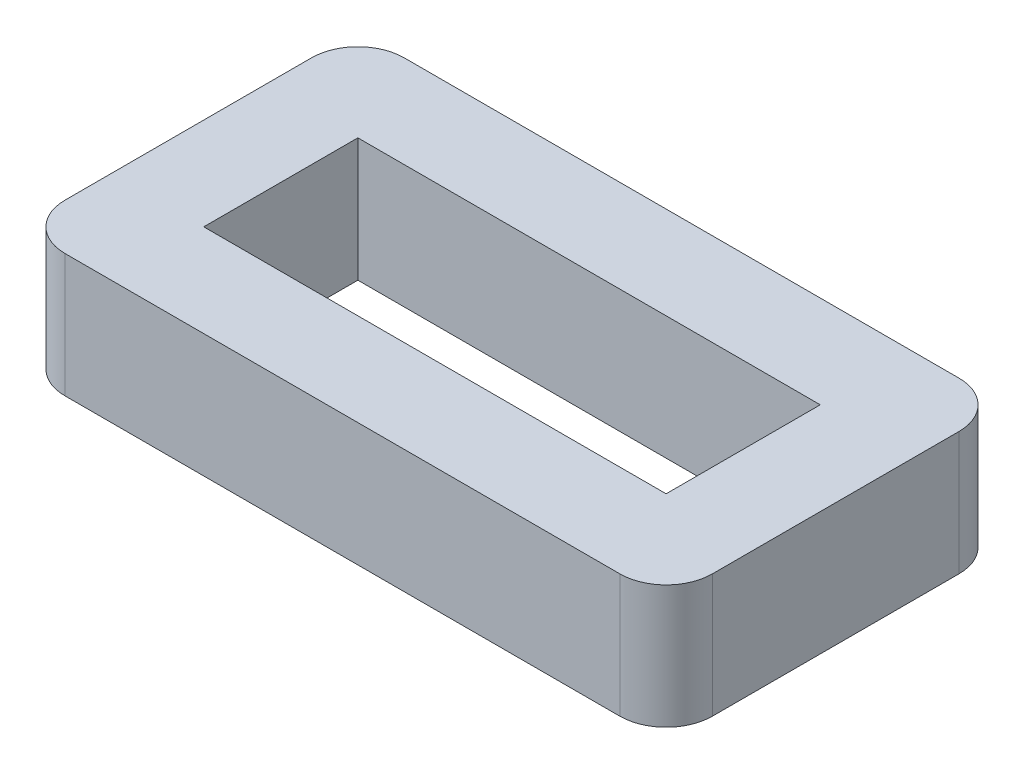
ISO-10303-21;
HEADER;
FILE_DESCRIPTION(('STEP AP214'),'2;1');
FILE_NAME('part.step','',(''),(''),'','','');
FILE_SCHEMA(('AUTOMOTIVE_DESIGN { 1 0 10303 214 1 1 1 1 }'));
ENDSEC;
DATA;
#1=APPLICATION_CONTEXT('core data for automotive mechanical design processes');
#2=APPLICATION_PROTOCOL_DEFINITION('international standard','automotive_design',2000,#1);
#3=PRODUCT_CONTEXT('',#1,'mechanical');
#4=PRODUCT('Part','Part','',(#3));
#5=PRODUCT_RELATED_PRODUCT_CATEGORY('part','',(#4));
#6=PRODUCT_DEFINITION_FORMATION('','',#4);
#7=PRODUCT_DEFINITION_CONTEXT('part definition',#1,'design');
#8=PRODUCT_DEFINITION('design','',#6,#7);
#9=PRODUCT_DEFINITION_SHAPE('','',#8);
#10=(LENGTH_UNIT() NAMED_UNIT(*) SI_UNIT(.MILLI.,.METRE.));
#11=(NAMED_UNIT(*) PLANE_ANGLE_UNIT() SI_UNIT($,.RADIAN.));
#12=(NAMED_UNIT(*) SI_UNIT($,.STERADIAN.) SOLID_ANGLE_UNIT());
#13=UNCERTAINTY_MEASURE_WITH_UNIT(LENGTH_MEASURE(1.E-05),#10,'distance_accuracy_value','');
#14=(GEOMETRIC_REPRESENTATION_CONTEXT(3) GLOBAL_UNCERTAINTY_ASSIGNED_CONTEXT((#13)) GLOBAL_UNIT_ASSIGNED_CONTEXT((#10,
#11,#12)) REPRESENTATION_CONTEXT('',''));
#15=CARTESIAN_POINT('',(0.,0.,0.));
#16=DIRECTION('',(0.,0.,1.));
#17=DIRECTION('',(1.,0.,0.));
#18=AXIS2_PLACEMENT_3D('',#15,#16,#17);
#19=CARTESIAN_POINT('',(9.,4.,4.));
#20=DIRECTION('',(0.,1.,0.));
#21=DIRECTION('',(0.,0.,1.));
#22=AXIS2_PLACEMENT_3D('',#19,#20,#21);
#23=PLANE('',#22);
#24=CARTESIAN_POINT('',(9.,4.,4.));
#25=DIRECTION('',(0.,1.,0.));
#26=DIRECTION('',(0.,0.,1.));
#27=AXIS2_PLACEMENT_3D('',#24,#25,#26);
#28=CIRCLE('',#27,1.5);
#29=CARTESIAN_POINT('',(9.,4.,5.5));
#30=VERTEX_POINT('',#29);
#31=CARTESIAN_POINT('',(10.5,4.,4.));
#32=VERTEX_POINT('',#31);
#33=EDGE_CURVE('E158',#30,#32,#28,.T.);
#34=ORIENTED_EDGE('',*,*,#33,.T.);
#35=DIRECTION('',(0.,0.,-1.));
#36=VECTOR('',#35,1.);
#37=CARTESIAN_POINT('',(10.5,4.,-4.));
#38=LINE('',#37,#36);
#39=CARTESIAN_POINT('',(10.5,4.,-4.));
#40=VERTEX_POINT('',#39);
#41=EDGE_CURVE('E161',#32,#40,#38,.T.);
#42=ORIENTED_EDGE('',*,*,#41,.T.);
#43=CARTESIAN_POINT('',(9.,4.,-4.));
#44=DIRECTION('',(0.,1.,0.));
#45=DIRECTION('',(0.,0.,1.));
#46=AXIS2_PLACEMENT_3D('',#43,#44,#45);
#47=CIRCLE('',#46,1.5);
#48=CARTESIAN_POINT('',(9.,4.,-5.5));
#49=VERTEX_POINT('',#48);
#50=EDGE_CURVE('E164',#40,#49,#47,.T.);
#51=ORIENTED_EDGE('',*,*,#50,.T.);
#52=DIRECTION('',(-1.,0.,0.));
#53=VECTOR('',#52,1.);
#54=CARTESIAN_POINT('',(-9.,4.,-5.5));
#55=LINE('',#54,#53);
#56=CARTESIAN_POINT('',(-9.,4.,-5.5));
#57=VERTEX_POINT('',#56);
#58=EDGE_CURVE('E166',#49,#57,#55,.T.);
#59=ORIENTED_EDGE('',*,*,#58,.T.);
#60=CARTESIAN_POINT('',(-9.,4.,-4.));
#61=DIRECTION('',(0.,1.,0.));
#62=DIRECTION('',(0.,0.,-1.));
#63=AXIS2_PLACEMENT_3D('',#60,#61,#62);
#64=CIRCLE('',#63,1.5);
#65=CARTESIAN_POINT('',(-10.5,4.,-4.));
#66=VERTEX_POINT('',#65);
#67=EDGE_CURVE('E168',#57,#66,#64,.T.);
#68=ORIENTED_EDGE('',*,*,#67,.T.);
#69=DIRECTION('',(0.,0.,1.));
#70=VECTOR('',#69,1.);
#71=CARTESIAN_POINT('',(-10.5,4.,-4.));
#72=LINE('',#71,#70);
#73=CARTESIAN_POINT('',(-10.5,4.,4.));
#74=VERTEX_POINT('',#73);
#75=EDGE_CURVE('E170',#66,#74,#72,.T.);
#76=ORIENTED_EDGE('',*,*,#75,.T.);
#77=CARTESIAN_POINT('',(-9.,4.,4.));
#78=DIRECTION('',(0.,1.,0.));
#79=DIRECTION('',(0.,0.,1.));
#80=AXIS2_PLACEMENT_3D('',#77,#78,#79);
#81=CIRCLE('',#80,1.5);
#82=CARTESIAN_POINT('',(-9.,4.,5.5));
#83=VERTEX_POINT('',#82);
#84=EDGE_CURVE('E172',#74,#83,#81,.T.);
#85=ORIENTED_EDGE('',*,*,#84,.T.);
#86=DIRECTION('',(1.,0.,0.));
#87=VECTOR('',#86,1.);
#88=CARTESIAN_POINT('',(-9.,4.,5.5));
#89=LINE('',#88,#87);
#90=EDGE_CURVE('E174',#83,#30,#89,.T.);
#91=ORIENTED_EDGE('',*,*,#90,.T.);
#92=EDGE_LOOP('',(#34,#42,#51,#59,#68,#76,#85,#91));
#93=FACE_BOUND('',#92,.T.);
#94=DIRECTION('',(1.,0.,0.));
#95=VECTOR('',#94,1.);
#96=CARTESIAN_POINT('',(-7.5,4.,2.5));
#97=LINE('',#96,#95);
#98=CARTESIAN_POINT('',(-7.5,4.,2.5));
#99=VERTEX_POINT('',#98);
#100=CARTESIAN_POINT('',(7.5,4.,2.5));
#101=VERTEX_POINT('',#100);
#102=EDGE_CURVE('E130',#99,#101,#97,.T.);
#103=ORIENTED_EDGE('',*,*,#102,.F.);
#104=DIRECTION('',(0.,0.,1.));
#105=VECTOR('',#104,1.);
#106=CARTESIAN_POINT('',(-7.5,4.,-2.5));
#107=LINE('',#106,#105);
#108=CARTESIAN_POINT('',(-7.5,4.,-2.5));
#109=VERTEX_POINT('',#108);
#110=EDGE_CURVE('E122',#109,#99,#107,.T.);
#111=ORIENTED_EDGE('',*,*,#110,.F.);
#112=DIRECTION('',(-1.,0.,0.));
#113=VECTOR('',#112,1.);
#114=CARTESIAN_POINT('',(-7.5,4.,-2.5));
#115=LINE('',#114,#113);
#116=CARTESIAN_POINT('',(7.5,4.,-2.5));
#117=VERTEX_POINT('',#116);
#118=EDGE_CURVE('E144',#117,#109,#115,.T.);
#119=ORIENTED_EDGE('',*,*,#118,.F.);
#120=DIRECTION('',(0.,0.,-1.));
#121=VECTOR('',#120,1.);
#122=CARTESIAN_POINT('',(7.5,4.,-2.5));
#123=LINE('',#122,#121);
#124=EDGE_CURVE('E142',#101,#117,#123,.T.);
#125=ORIENTED_EDGE('',*,*,#124,.F.);
#126=EDGE_LOOP('',(#103,#111,#119,#125));
#127=FACE_BOUND('',#126,.T.);
#128=ADVANCED_FACE('F33',(#93,#127),#23,.T.);
#129=CARTESIAN_POINT('',(9.,0.,4.));
#130=DIRECTION('',(0.,1.,0.));
#131=DIRECTION('',(0.,0.,1.));
#132=AXIS2_PLACEMENT_3D('',#129,#130,#131);
#133=PLANE('',#132);
#134=CARTESIAN_POINT('',(9.,0.,4.));
#135=DIRECTION('',(0.,1.,0.));
#136=DIRECTION('',(0.,0.,1.));
#137=AXIS2_PLACEMENT_3D('',#134,#135,#136);
#138=CIRCLE('',#137,1.5);
#139=CARTESIAN_POINT('',(9.,0.,5.5));
#140=VERTEX_POINT('',#139);
#141=CARTESIAN_POINT('',(10.5,0.,4.));
#142=VERTEX_POINT('',#141);
#143=EDGE_CURVE('E138',#140,#142,#138,.T.);
#144=ORIENTED_EDGE('',*,*,#143,.F.);
#145=DIRECTION('',(1.,0.,0.));
#146=VECTOR('',#145,1.);
#147=CARTESIAN_POINT('',(-9.,0.,5.5));
#148=LINE('',#147,#146);
#149=CARTESIAN_POINT('',(-9.,0.,5.5));
#150=VERTEX_POINT('',#149);
#151=EDGE_CURVE('E162',#150,#140,#148,.T.);
#152=ORIENTED_EDGE('',*,*,#151,.F.);
#153=CARTESIAN_POINT('',(-9.,0.,4.));
#154=DIRECTION('',(0.,1.,0.));
#155=DIRECTION('',(0.,0.,1.));
#156=AXIS2_PLACEMENT_3D('',#153,#154,#155);
#157=CIRCLE('',#156,1.5);
#158=CARTESIAN_POINT('',(-10.5,0.,4.));
#159=VERTEX_POINT('',#158);
#160=EDGE_CURVE('E189',#159,#150,#157,.T.);
#161=ORIENTED_EDGE('',*,*,#160,.F.);
#162=DIRECTION('',(0.,0.,1.));
#163=VECTOR('',#162,1.);
#164=CARTESIAN_POINT('',(-10.5,0.,-4.));
#165=LINE('',#164,#163);
#166=CARTESIAN_POINT('',(-10.5,0.,-4.));
#167=VERTEX_POINT('',#166);
#168=EDGE_CURVE('E187',#167,#159,#165,.T.);
#169=ORIENTED_EDGE('',*,*,#168,.F.);
#170=CARTESIAN_POINT('',(-9.,0.,-4.));
#171=DIRECTION('',(0.,1.,0.));
#172=DIRECTION('',(0.,0.,-1.));
#173=AXIS2_PLACEMENT_3D('',#170,#171,#172);
#174=CIRCLE('',#173,1.5);
#175=CARTESIAN_POINT('',(-9.,0.,-5.5));
#176=VERTEX_POINT('',#175);
#177=EDGE_CURVE('E185',#176,#167,#174,.T.);
#178=ORIENTED_EDGE('',*,*,#177,.F.);
#179=DIRECTION('',(-1.,0.,0.));
#180=VECTOR('',#179,1.);
#181=CARTESIAN_POINT('',(-9.,0.,-5.5));
#182=LINE('',#181,#180);
#183=CARTESIAN_POINT('',(9.,0.,-5.5));
#184=VERTEX_POINT('',#183);
#185=EDGE_CURVE('E183',#184,#176,#182,.T.);
#186=ORIENTED_EDGE('',*,*,#185,.F.);
#187=CARTESIAN_POINT('',(9.,0.,-4.));
#188=DIRECTION('',(0.,1.,0.));
#189=DIRECTION('',(0.,0.,1.));
#190=AXIS2_PLACEMENT_3D('',#187,#188,#189);
#191=CIRCLE('',#190,1.5);
#192=CARTESIAN_POINT('',(10.5,0.,-4.));
#193=VERTEX_POINT('',#192);
#194=EDGE_CURVE('E181',#193,#184,#191,.T.);
#195=ORIENTED_EDGE('',*,*,#194,.F.);
#196=DIRECTION('',(0.,0.,-1.));
#197=VECTOR('',#196,1.);
#198=CARTESIAN_POINT('',(10.5,0.,-4.));
#199=LINE('',#198,#197);
#200=EDGE_CURVE('E179',#142,#193,#199,.T.);
#201=ORIENTED_EDGE('',*,*,#200,.F.);
#202=EDGE_LOOP('',(#144,#152,#161,#169,#178,#186,#195,#201));
#203=FACE_BOUND('',#202,.T.);
#204=DIRECTION('',(0.,0.,1.));
#205=VECTOR('',#204,1.);
#206=CARTESIAN_POINT('',(-7.5,0.,-2.5));
#207=LINE('',#206,#205);
#208=CARTESIAN_POINT('',(-7.5,0.,-2.5));
#209=VERTEX_POINT('',#208);
#210=CARTESIAN_POINT('',(-7.5,0.,2.5));
#211=VERTEX_POINT('',#210);
#212=EDGE_CURVE('E56',#209,#211,#207,.T.);
#213=ORIENTED_EDGE('',*,*,#212,.T.);
#214=DIRECTION('',(1.,0.,0.));
#215=VECTOR('',#214,1.);
#216=CARTESIAN_POINT('',(-7.5,0.,2.5));
#217=LINE('',#216,#215);
#218=CARTESIAN_POINT('',(7.5,0.,2.5));
#219=VERTEX_POINT('',#218);
#220=EDGE_CURVE('E137',#211,#219,#217,.T.);
#221=ORIENTED_EDGE('',*,*,#220,.T.);
#222=DIRECTION('',(0.,0.,-1.));
#223=VECTOR('',#222,1.);
#224=CARTESIAN_POINT('',(7.5,0.,-2.5));
#225=LINE('',#224,#223);
#226=CARTESIAN_POINT('',(7.5,0.,-2.5));
#227=VERTEX_POINT('',#226);
#228=EDGE_CURVE('E150',#219,#227,#225,.T.);
#229=ORIENTED_EDGE('',*,*,#228,.T.);
#230=DIRECTION('',(-1.,0.,0.));
#231=VECTOR('',#230,1.);
#232=CARTESIAN_POINT('',(-7.5,0.,-2.5));
#233=LINE('',#232,#231);
#234=EDGE_CURVE('E131',#227,#209,#233,.T.);
#235=ORIENTED_EDGE('',*,*,#234,.T.);
#236=EDGE_LOOP('',(#213,#221,#229,#235));
#237=FACE_BOUND('',#236,.T.);
#238=ADVANCED_FACE('F219',(#203,#237),#133,.F.);
#239=CARTESIAN_POINT('',(9.,4.,4.));
#240=DIRECTION('',(0.,-1.,0.));
#241=DIRECTION('',(0.,0.,-1.));
#242=AXIS2_PLACEMENT_3D('',#239,#240,#241);
#243=CYLINDRICAL_SURFACE('',#242,1.5);
#244=ORIENTED_EDGE('',*,*,#143,.T.);
#245=DIRECTION('',(0.,-1.,0.));
#246=VECTOR('',#245,1.);
#247=CARTESIAN_POINT('',(10.5,4.,4.));
#248=LINE('',#247,#246);
#249=EDGE_CURVE('E11',#32,#142,#248,.T.);
#250=ORIENTED_EDGE('',*,*,#249,.F.);
#251=ORIENTED_EDGE('',*,*,#33,.F.);
#252=DIRECTION('',(0.,-1.,0.));
#253=VECTOR('',#252,1.);
#254=CARTESIAN_POINT('',(9.,4.,5.5));
#255=LINE('',#254,#253);
#256=EDGE_CURVE('E176',#30,#140,#255,.T.);
#257=ORIENTED_EDGE('',*,*,#256,.T.);
#258=EDGE_LOOP('',(#244,#250,#251,#257));
#259=FACE_BOUND('',#258,.T.);
#260=ADVANCED_FACE('F35',(#259),#243,.T.);
#261=CARTESIAN_POINT('',(10.5,4.,-4.));
#262=DIRECTION('',(-1.,0.,0.));
#263=DIRECTION('',(0.,0.,1.));
#264=AXIS2_PLACEMENT_3D('',#261,#262,#263);
#265=PLANE('',#264);
#266=ORIENTED_EDGE('',*,*,#200,.T.);
#267=DIRECTION('',(0.,-1.,0.));
#268=VECTOR('',#267,1.);
#269=CARTESIAN_POINT('',(10.5,4.,-4.));
#270=LINE('',#269,#268);
#271=EDGE_CURVE('E41',#40,#193,#270,.T.);
#272=ORIENTED_EDGE('',*,*,#271,.F.);
#273=ORIENTED_EDGE('',*,*,#41,.F.);
#274=ORIENTED_EDGE('',*,*,#249,.T.);
#275=EDGE_LOOP('',(#266,#272,#273,#274));
#276=FACE_BOUND('',#275,.T.);
#277=ADVANCED_FACE('F236',(#276),#265,.F.);
#278=CARTESIAN_POINT('',(9.,4.,-4.));
#279=DIRECTION('',(0.,-1.,0.));
#280=DIRECTION('',(0.,0.,-1.));
#281=AXIS2_PLACEMENT_3D('',#278,#279,#280);
#282=CYLINDRICAL_SURFACE('',#281,1.5);
#283=ORIENTED_EDGE('',*,*,#194,.T.);
#284=DIRECTION('',(0.,-1.,0.));
#285=VECTOR('',#284,1.);
#286=CARTESIAN_POINT('',(9.,4.,-5.5));
#287=LINE('',#286,#285);
#288=EDGE_CURVE('E206',#49,#184,#287,.T.);
#289=ORIENTED_EDGE('',*,*,#288,.F.);
#290=ORIENTED_EDGE('',*,*,#50,.F.);
#291=ORIENTED_EDGE('',*,*,#271,.T.);
#292=EDGE_LOOP('',(#283,#289,#290,#291));
#293=FACE_BOUND('',#292,.T.);
#294=ADVANCED_FACE('F213',(#293),#282,.T.);
#295=CARTESIAN_POINT('',(-9.,4.,-5.5));
#296=DIRECTION('',(0.,0.,1.));
#297=DIRECTION('',(1.,0.,0.));
#298=AXIS2_PLACEMENT_3D('',#295,#296,#297);
#299=PLANE('',#298);
#300=ORIENTED_EDGE('',*,*,#185,.T.);
#301=DIRECTION('',(0.,-1.,0.));
#302=VECTOR('',#301,1.);
#303=CARTESIAN_POINT('',(-9.,4.,-5.5));
#304=LINE('',#303,#302);
#305=EDGE_CURVE('E203',#57,#176,#304,.T.);
#306=ORIENTED_EDGE('',*,*,#305,.F.);
#307=ORIENTED_EDGE('',*,*,#58,.F.);
#308=ORIENTED_EDGE('',*,*,#288,.T.);
#309=EDGE_LOOP('',(#300,#306,#307,#308));
#310=FACE_BOUND('',#309,.T.);
#311=ADVANCED_FACE('F225',(#310),#299,.F.);
#312=CARTESIAN_POINT('',(-9.,4.,-4.));
#313=DIRECTION('',(0.,-1.,0.));
#314=DIRECTION('',(0.,0.,-1.));
#315=AXIS2_PLACEMENT_3D('',#312,#313,#314);
#316=CYLINDRICAL_SURFACE('',#315,1.5);
#317=ORIENTED_EDGE('',*,*,#177,.T.);
#318=DIRECTION('',(0.,-1.,0.));
#319=VECTOR('',#318,1.);
#320=CARTESIAN_POINT('',(-10.5,4.,-4.));
#321=LINE('',#320,#319);
#322=EDGE_CURVE('E200',#66,#167,#321,.T.);
#323=ORIENTED_EDGE('',*,*,#322,.F.);
#324=ORIENTED_EDGE('',*,*,#67,.F.);
#325=ORIENTED_EDGE('',*,*,#305,.T.);
#326=EDGE_LOOP('',(#317,#323,#324,#325));
#327=FACE_BOUND('',#326,.T.);
#328=ADVANCED_FACE('F229',(#327),#316,.T.);
#329=CARTESIAN_POINT('',(-10.5,4.,-4.));
#330=DIRECTION('',(1.,0.,0.));
#331=DIRECTION('',(0.,0.,-1.));
#332=AXIS2_PLACEMENT_3D('',#329,#330,#331);
#333=PLANE('',#332);
#334=ORIENTED_EDGE('',*,*,#168,.T.);
#335=DIRECTION('',(0.,-1.,0.));
#336=VECTOR('',#335,1.);
#337=CARTESIAN_POINT('',(-10.5,4.,4.));
#338=LINE('',#337,#336);
#339=EDGE_CURVE('E197',#74,#159,#338,.T.);
#340=ORIENTED_EDGE('',*,*,#339,.F.);
#341=ORIENTED_EDGE('',*,*,#75,.F.);
#342=ORIENTED_EDGE('',*,*,#322,.T.);
#343=EDGE_LOOP('',(#334,#340,#341,#342));
#344=FACE_BOUND('',#343,.T.);
#345=ADVANCED_FACE('F249',(#344),#333,.F.);
#346=CARTESIAN_POINT('',(-9.,4.,4.));
#347=DIRECTION('',(0.,-1.,0.));
#348=DIRECTION('',(0.,0.,-1.));
#349=AXIS2_PLACEMENT_3D('',#346,#347,#348);
#350=CYLINDRICAL_SURFACE('',#349,1.5);
#351=ORIENTED_EDGE('',*,*,#160,.T.);
#352=DIRECTION('',(0.,-1.,0.));
#353=VECTOR('',#352,1.);
#354=CARTESIAN_POINT('',(-9.,4.,5.5));
#355=LINE('',#354,#353);
#356=EDGE_CURVE('E194',#83,#150,#355,.T.);
#357=ORIENTED_EDGE('',*,*,#356,.F.);
#358=ORIENTED_EDGE('',*,*,#84,.F.);
#359=ORIENTED_EDGE('',*,*,#339,.T.);
#360=EDGE_LOOP('',(#351,#357,#358,#359));
#361=FACE_BOUND('',#360,.T.);
#362=ADVANCED_FACE('F247',(#361),#350,.T.);
#363=CARTESIAN_POINT('',(-9.,4.,5.5));
#364=DIRECTION('',(0.,0.,-1.));
#365=DIRECTION('',(-1.,0.,0.));
#366=AXIS2_PLACEMENT_3D('',#363,#364,#365);
#367=PLANE('',#366);
#368=ORIENTED_EDGE('',*,*,#151,.T.);
#369=ORIENTED_EDGE('',*,*,#256,.F.);
#370=ORIENTED_EDGE('',*,*,#90,.F.);
#371=ORIENTED_EDGE('',*,*,#356,.T.);
#372=EDGE_LOOP('',(#368,#369,#370,#371));
#373=FACE_BOUND('',#372,.T.);
#374=ADVANCED_FACE('F242',(#373),#367,.F.);
#375=CARTESIAN_POINT('',(-7.5,4.,-2.5));
#376=DIRECTION('',(1.,0.,0.));
#377=DIRECTION('',(0.,0.,-1.));
#378=AXIS2_PLACEMENT_3D('',#375,#376,#377);
#379=PLANE('',#378);
#380=ORIENTED_EDGE('',*,*,#212,.F.);
#381=DIRECTION('',(0.,-1.,0.));
#382=VECTOR('',#381,1.);
#383=CARTESIAN_POINT('',(-7.5,4.,-2.5));
#384=LINE('',#383,#382);
#385=EDGE_CURVE('E126',#109,#209,#384,.T.);
#386=ORIENTED_EDGE('',*,*,#385,.F.);
#387=ORIENTED_EDGE('',*,*,#110,.T.);
#388=DIRECTION('',(0.,-1.,0.));
#389=VECTOR('',#388,1.);
#390=CARTESIAN_POINT('',(-7.5,4.,2.5));
#391=LINE('',#390,#389);
#392=EDGE_CURVE('E125',#99,#211,#391,.T.);
#393=ORIENTED_EDGE('',*,*,#392,.T.);
#394=EDGE_LOOP('',(#380,#386,#387,#393));
#395=FACE_BOUND('',#394,.T.);
#396=ADVANCED_FACE('F124',(#395),#379,.T.);
#397=CARTESIAN_POINT('',(-7.5,4.,2.5));
#398=DIRECTION('',(0.,0.,-1.));
#399=DIRECTION('',(-1.,0.,0.));
#400=AXIS2_PLACEMENT_3D('',#397,#398,#399);
#401=PLANE('',#400);
#402=ORIENTED_EDGE('',*,*,#220,.F.);
#403=ORIENTED_EDGE('',*,*,#392,.F.);
#404=ORIENTED_EDGE('',*,*,#102,.T.);
#405=DIRECTION('',(0.,-1.,0.));
#406=VECTOR('',#405,1.);
#407=CARTESIAN_POINT('',(7.5,4.,2.5));
#408=LINE('',#407,#406);
#409=EDGE_CURVE('E139',#101,#219,#408,.T.);
#410=ORIENTED_EDGE('',*,*,#409,.T.);
#411=EDGE_LOOP('',(#402,#403,#404,#410));
#412=FACE_BOUND('',#411,.T.);
#413=ADVANCED_FACE('F134',(#412),#401,.T.);
#414=CARTESIAN_POINT('',(7.5,4.,-2.5));
#415=DIRECTION('',(-1.,0.,0.));
#416=DIRECTION('',(0.,0.,1.));
#417=AXIS2_PLACEMENT_3D('',#414,#415,#416);
#418=PLANE('',#417);
#419=ORIENTED_EDGE('',*,*,#228,.F.);
#420=ORIENTED_EDGE('',*,*,#409,.F.);
#421=ORIENTED_EDGE('',*,*,#124,.T.);
#422=DIRECTION('',(0.,-1.,0.));
#423=VECTOR('',#422,1.);
#424=CARTESIAN_POINT('',(7.5,4.,-2.5));
#425=LINE('',#424,#423);
#426=EDGE_CURVE('E48',#117,#227,#425,.T.);
#427=ORIENTED_EDGE('',*,*,#426,.T.);
#428=EDGE_LOOP('',(#419,#420,#421,#427));
#429=FACE_BOUND('',#428,.T.);
#430=ADVANCED_FACE('F274',(#429),#418,.T.);
#431=CARTESIAN_POINT('',(-7.5,4.,-2.5));
#432=DIRECTION('',(0.,0.,1.));
#433=DIRECTION('',(1.,0.,0.));
#434=AXIS2_PLACEMENT_3D('',#431,#432,#433);
#435=PLANE('',#434);
#436=ORIENTED_EDGE('',*,*,#234,.F.);
#437=ORIENTED_EDGE('',*,*,#426,.F.);
#438=ORIENTED_EDGE('',*,*,#118,.T.);
#439=ORIENTED_EDGE('',*,*,#385,.T.);
#440=EDGE_LOOP('',(#436,#437,#438,#439));
#441=FACE_BOUND('',#440,.T.);
#442=ADVANCED_FACE('F278',(#441),#435,.T.);
#443=CLOSED_SHELL('',(#128,#238,#260,#277,#294,#311,#328,#345,#362,#374,#396,#413,#430,#442));
#444=MANIFOLD_SOLID_BREP('B2',#443);
#445=ADVANCED_BREP_SHAPE_REPRESENTATION('',(#18,#444),#14);
#446=SHAPE_DEFINITION_REPRESENTATION(#9,#445);
ENDSEC;
END-ISO-10303-21;
